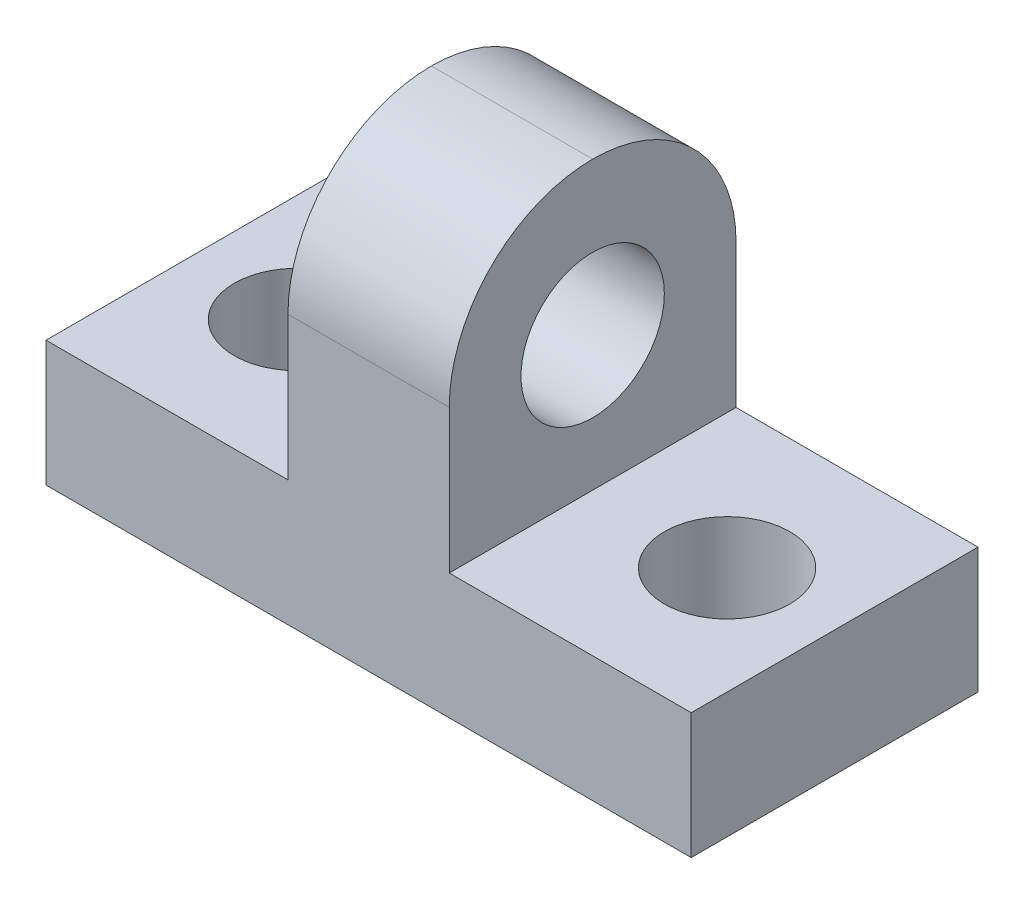
ISO-10303-21;
HEADER;
FILE_DESCRIPTION(('STEP AP214'),'2;1');
FILE_NAME('part.step','',(''),(''),'','','');
FILE_SCHEMA(('AUTOMOTIVE_DESIGN { 1 0 10303 214 1 1 1 1 }'));
ENDSEC;
DATA;
#1=APPLICATION_CONTEXT('core data for automotive mechanical design processes');
#2=APPLICATION_PROTOCOL_DEFINITION('international standard','automotive_design',2000,#1);
#3=PRODUCT_CONTEXT('',#1,'mechanical');
#4=PRODUCT('Part','Part','',(#3));
#5=PRODUCT_RELATED_PRODUCT_CATEGORY('part','',(#4));
#6=PRODUCT_DEFINITION_FORMATION('','',#4);
#7=PRODUCT_DEFINITION_CONTEXT('part definition',#1,'design');
#8=PRODUCT_DEFINITION('design','',#6,#7);
#9=PRODUCT_DEFINITION_SHAPE('','',#8);
#10=(LENGTH_UNIT() NAMED_UNIT(*) SI_UNIT(.MILLI.,.METRE.));
#11=(NAMED_UNIT(*) PLANE_ANGLE_UNIT() SI_UNIT($,.RADIAN.));
#12=(NAMED_UNIT(*) SI_UNIT($,.STERADIAN.) SOLID_ANGLE_UNIT());
#13=UNCERTAINTY_MEASURE_WITH_UNIT(LENGTH_MEASURE(1.E-05),#10,'distance_accuracy_value','');
#14=(GEOMETRIC_REPRESENTATION_CONTEXT(3) GLOBAL_UNCERTAINTY_ASSIGNED_CONTEXT((#13)) GLOBAL_UNIT_ASSIGNED_CONTEXT((#10,
#11,#12)) REPRESENTATION_CONTEXT('',''));
#15=CARTESIAN_POINT('',(0.,0.,0.));
#16=DIRECTION('',(0.,0.,1.));
#17=DIRECTION('',(1.,0.,0.));
#18=AXIS2_PLACEMENT_3D('',#15,#16,#17);
#19=CARTESIAN_POINT('',(-36.,0.,16.));
#20=DIRECTION('',(1.,0.,0.));
#21=DIRECTION('',(0.,1.,0.));
#22=AXIS2_PLACEMENT_3D('',#19,#20,#21);
#23=PLANE('',#22);
#24=DIRECTION('',(0.,-1.,0.));
#25=VECTOR('',#24,1.);
#26=CARTESIAN_POINT('',(-36.,0.,-16.));
#27=LINE('',#26,#25);
#28=CARTESIAN_POINT('',(-36.,14.,-16.));
#29=VERTEX_POINT('',#28);
#30=CARTESIAN_POINT('',(-36.,0.,-16.));
#31=VERTEX_POINT('',#30);
#32=EDGE_CURVE('E131',#29,#31,#27,.T.);
#33=ORIENTED_EDGE('',*,*,#32,.T.);
#34=DIRECTION('',(0.,0.,-1.));
#35=VECTOR('',#34,1.);
#36=CARTESIAN_POINT('',(-36.,0.,16.));
#37=LINE('',#36,#35);
#38=CARTESIAN_POINT('',(-36.,0.,16.));
#39=VERTEX_POINT('',#38);
#40=EDGE_CURVE('E110',#39,#31,#37,.T.);
#41=ORIENTED_EDGE('',*,*,#40,.F.);
#42=DIRECTION('',(0.,-1.,0.));
#43=VECTOR('',#42,1.);
#44=CARTESIAN_POINT('',(-36.,0.,16.));
#45=LINE('',#44,#43);
#46=CARTESIAN_POINT('',(-36.,14.,16.));
#47=VERTEX_POINT('',#46);
#48=EDGE_CURVE('E118',#47,#39,#45,.T.);
#49=ORIENTED_EDGE('',*,*,#48,.F.);
#50=DIRECTION('',(0.,0.,-1.));
#51=VECTOR('',#50,1.);
#52=CARTESIAN_POINT('',(-36.,14.,16.));
#53=LINE('',#52,#51);
#54=EDGE_CURVE('E187',#47,#29,#53,.T.);
#55=ORIENTED_EDGE('',*,*,#54,.T.);
#56=EDGE_LOOP('',(#33,#41,#49,#55));
#57=FACE_BOUND('',#56,.T.);
#58=ADVANCED_FACE('F36',(#57),#23,.F.);
#59=CARTESIAN_POINT('',(36.,0.,16.));
#60=DIRECTION('',(0.,1.,0.));
#61=DIRECTION('',(0.,0.,1.));
#62=AXIS2_PLACEMENT_3D('',#59,#60,#61);
#63=PLANE('',#62);
#64=CARTESIAN_POINT('',(-24.,0.,0.));
#65=DIRECTION('',(0.,1.,0.));
#66=DIRECTION('',(-1.,0.,0.));
#67=AXIS2_PLACEMENT_3D('',#64,#65,#66);
#68=CIRCLE('',#67,7.);
#69=CARTESIAN_POINT('',(-31.,0.,0.));
#70=VERTEX_POINT('',#69);
#71=EDGE_CURVE('E238',#70,#70,#68,.T.);
#72=ORIENTED_EDGE('',*,*,#71,.T.);
#73=EDGE_LOOP('',(#72));
#74=FACE_BOUND('',#73,.T.);
#75=CARTESIAN_POINT('',(24.,0.,0.));
#76=DIRECTION('',(0.,1.,0.));
#77=DIRECTION('',(1.,0.,0.));
#78=AXIS2_PLACEMENT_3D('',#75,#76,#77);
#79=CIRCLE('',#78,7.);
#80=CARTESIAN_POINT('',(31.,0.,0.));
#81=VERTEX_POINT('',#80);
#82=EDGE_CURVE('E229',#81,#81,#79,.T.);
#83=ORIENTED_EDGE('',*,*,#82,.T.);
#84=EDGE_LOOP('',(#83));
#85=FACE_BOUND('',#84,.T.);
#86=DIRECTION('',(1.,0.,0.));
#87=VECTOR('',#86,1.);
#88=CARTESIAN_POINT('',(36.,0.,-16.));
#89=LINE('',#88,#87);
#90=CARTESIAN_POINT('',(36.,0.,-16.));
#91=VERTEX_POINT('',#90);
#92=EDGE_CURVE('E205',#31,#91,#89,.T.);
#93=ORIENTED_EDGE('',*,*,#92,.T.);
#94=DIRECTION('',(0.,0.,-1.));
#95=VECTOR('',#94,1.);
#96=CARTESIAN_POINT('',(36.,0.,16.));
#97=LINE('',#96,#95);
#98=CARTESIAN_POINT('',(36.,0.,16.));
#99=VERTEX_POINT('',#98);
#100=EDGE_CURVE('E113',#99,#91,#97,.T.);
#101=ORIENTED_EDGE('',*,*,#100,.F.);
#102=DIRECTION('',(1.,0.,0.));
#103=VECTOR('',#102,1.);
#104=CARTESIAN_POINT('',(36.,0.,16.));
#105=LINE('',#104,#103);
#106=EDGE_CURVE('E106',#39,#99,#105,.T.);
#107=ORIENTED_EDGE('',*,*,#106,.F.);
#108=ORIENTED_EDGE('',*,*,#40,.T.);
#109=EDGE_LOOP('',(#93,#101,#107,#108));
#110=FACE_BOUND('',#109,.T.);
#111=ADVANCED_FACE('F108',(#74,#85,#110),#63,.F.);
#112=CARTESIAN_POINT('',(36.,0.,16.));
#113=DIRECTION('',(-1.,0.,0.));
#114=DIRECTION('',(0.,-1.,0.));
#115=AXIS2_PLACEMENT_3D('',#112,#113,#114);
#116=PLANE('',#115);
#117=DIRECTION('',(0.,1.,0.));
#118=VECTOR('',#117,1.);
#119=CARTESIAN_POINT('',(36.,0.,-16.));
#120=LINE('',#119,#118);
#121=CARTESIAN_POINT('',(36.,14.,-16.));
#122=VERTEX_POINT('',#121);
#123=EDGE_CURVE('E181',#91,#122,#120,.T.);
#124=ORIENTED_EDGE('',*,*,#123,.T.);
#125=DIRECTION('',(0.,0.,-1.));
#126=VECTOR('',#125,1.);
#127=CARTESIAN_POINT('',(36.,14.,16.));
#128=LINE('',#127,#126);
#129=CARTESIAN_POINT('',(36.,14.,16.));
#130=VERTEX_POINT('',#129);
#131=EDGE_CURVE('E140',#130,#122,#128,.T.);
#132=ORIENTED_EDGE('',*,*,#131,.F.);
#133=DIRECTION('',(0.,1.,0.));
#134=VECTOR('',#133,1.);
#135=CARTESIAN_POINT('',(36.,0.,16.));
#136=LINE('',#135,#134);
#137=EDGE_CURVE('E117',#99,#130,#136,.T.);
#138=ORIENTED_EDGE('',*,*,#137,.F.);
#139=ORIENTED_EDGE('',*,*,#100,.T.);
#140=EDGE_LOOP('',(#124,#132,#138,#139));
#141=FACE_BOUND('',#140,.T.);
#142=ADVANCED_FACE('F269',(#141),#116,.F.);
#143=CARTESIAN_POINT('',(36.,14.,16.));
#144=DIRECTION('',(0.,-1.,0.));
#145=DIRECTION('',(1.,0.,0.));
#146=AXIS2_PLACEMENT_3D('',#143,#144,#145);
#147=PLANE('',#146);
#148=CARTESIAN_POINT('',(24.,14.,0.));
#149=DIRECTION('',(0.,1.,0.));
#150=DIRECTION('',(1.,0.,0.));
#151=AXIS2_PLACEMENT_3D('',#148,#149,#150);
#152=CIRCLE('',#151,7.);
#153=CARTESIAN_POINT('',(31.,14.,0.));
#154=VERTEX_POINT('',#153);
#155=EDGE_CURVE('E225',#154,#154,#152,.T.);
#156=ORIENTED_EDGE('',*,*,#155,.F.);
#157=EDGE_LOOP('',(#156));
#158=FACE_BOUND('',#157,.T.);
#159=DIRECTION('',(-1.,0.,0.));
#160=VECTOR('',#159,1.);
#161=CARTESIAN_POINT('',(36.,14.,-16.));
#162=LINE('',#161,#160);
#163=CARTESIAN_POINT('',(9.,14.,-16.));
#164=VERTEX_POINT('',#163);
#165=EDGE_CURVE('E175',#122,#164,#162,.T.);
#166=ORIENTED_EDGE('',*,*,#165,.T.);
#167=DIRECTION('',(0.,0.,-1.));
#168=VECTOR('',#167,1.);
#169=CARTESIAN_POINT('',(9.,14.,16.));
#170=LINE('',#169,#168);
#171=CARTESIAN_POINT('',(9.,14.,16.));
#172=VERTEX_POINT('',#171);
#173=EDGE_CURVE('E173',#172,#164,#170,.T.);
#174=ORIENTED_EDGE('',*,*,#173,.F.);
#175=DIRECTION('',(-1.,0.,0.));
#176=VECTOR('',#175,1.);
#177=CARTESIAN_POINT('',(36.,14.,16.));
#178=LINE('',#177,#176);
#179=EDGE_CURVE('E202',#130,#172,#178,.T.);
#180=ORIENTED_EDGE('',*,*,#179,.F.);
#181=ORIENTED_EDGE('',*,*,#131,.T.);
#182=EDGE_LOOP('',(#166,#174,#180,#181));
#183=FACE_BOUND('',#182,.T.);
#184=ADVANCED_FACE('F201',(#158,#183),#147,.F.);
#185=CARTESIAN_POINT('',(9.,14.,16.));
#186=DIRECTION('',(-1.,0.,0.));
#187=DIRECTION('',(0.,0.,1.));
#188=AXIS2_PLACEMENT_3D('',#185,#186,#187);
#189=PLANE('',#188);
#190=CARTESIAN_POINT('',(9.,29.,0.));
#191=DIRECTION('',(1.,0.,0.));
#192=DIRECTION('',(0.,0.,-1.));
#193=AXIS2_PLACEMENT_3D('',#190,#191,#192);
#194=CIRCLE('',#193,8.);
#195=CARTESIAN_POINT('',(9.,29.,-8.));
#196=VERTEX_POINT('',#195);
#197=EDGE_CURVE('E242',#196,#196,#194,.T.);
#198=ORIENTED_EDGE('',*,*,#197,.F.);
#199=EDGE_LOOP('',(#198));
#200=FACE_BOUND('',#199,.T.);
#201=DIRECTION('',(0.,1.,0.));
#202=VECTOR('',#201,1.);
#203=CARTESIAN_POINT('',(9.,14.,-16.));
#204=LINE('',#203,#202);
#205=CARTESIAN_POINT('',(9.,30.,-16.));
#206=VERTEX_POINT('',#205);
#207=EDGE_CURVE('E165',#164,#206,#204,.T.);
#208=ORIENTED_EDGE('',*,*,#207,.T.);
#209=CARTESIAN_POINT('',(9.,30.,0.));
#210=DIRECTION('',(-1.,0.,0.));
#211=DIRECTION('',(0.,0.,1.));
#212=AXIS2_PLACEMENT_3D('',#209,#210,#211);
#213=CIRCLE('',#212,16.);
#214=CARTESIAN_POINT('',(9.,46.,0.));
#215=VERTEX_POINT('',#214);
#216=EDGE_CURVE('E46',#206,#215,#213,.F.);
#217=ORIENTED_EDGE('',*,*,#216,.T.);
#218=CARTESIAN_POINT('',(9.,30.,0.));
#219=DIRECTION('',(-1.,0.,0.));
#220=DIRECTION('',(0.,0.,1.));
#221=AXIS2_PLACEMENT_3D('',#218,#219,#220);
#222=CIRCLE('',#221,16.);
#223=CARTESIAN_POINT('',(9.,30.,16.));
#224=VERTEX_POINT('',#223);
#225=EDGE_CURVE('E53',#215,#224,#222,.F.);
#226=ORIENTED_EDGE('',*,*,#225,.T.);
#227=DIRECTION('',(0.,1.,0.));
#228=VECTOR('',#227,1.);
#229=CARTESIAN_POINT('',(9.,14.,16.));
#230=LINE('',#229,#228);
#231=EDGE_CURVE('E218',#172,#224,#230,.T.);
#232=ORIENTED_EDGE('',*,*,#231,.F.);
#233=ORIENTED_EDGE('',*,*,#173,.T.);
#234=EDGE_LOOP('',(#208,#217,#226,#232,#233));
#235=FACE_BOUND('',#234,.T.);
#236=ADVANCED_FACE('F171',(#200,#235),#189,.F.);
#237=CARTESIAN_POINT('',(-9.00000000000001,14.,16.));
#238=DIRECTION('',(1.,0.,0.));
#239=DIRECTION('',(0.,0.,-1.));
#240=AXIS2_PLACEMENT_3D('',#237,#238,#239);
#241=PLANE('',#240);
#242=CARTESIAN_POINT('',(-9.,29.,0.));
#243=DIRECTION('',(1.,0.,0.));
#244=DIRECTION('',(0.,0.,-1.));
#245=AXIS2_PLACEMENT_3D('',#242,#243,#244);
#246=CIRCLE('',#245,8.);
#247=CARTESIAN_POINT('',(-9.,29.,-8.));
#248=VERTEX_POINT('',#247);
#249=EDGE_CURVE('E230',#248,#248,#246,.T.);
#250=ORIENTED_EDGE('',*,*,#249,.T.);
#251=EDGE_LOOP('',(#250));
#252=FACE_BOUND('',#251,.T.);
#253=CARTESIAN_POINT('',(-9.00000000000001,30.,0.));
#254=DIRECTION('',(1.,0.,0.));
#255=DIRECTION('',(0.,0.,-1.));
#256=AXIS2_PLACEMENT_3D('',#253,#254,#255);
#257=CIRCLE('',#256,16.);
#258=CARTESIAN_POINT('',(-9.00000000000001,30.,16.));
#259=VERTEX_POINT('',#258);
#260=CARTESIAN_POINT('',(-9.00000000000001,46.,0.));
#261=VERTEX_POINT('',#260);
#262=EDGE_CURVE('E133',#259,#261,#257,.F.);
#263=ORIENTED_EDGE('',*,*,#262,.T.);
#264=CARTESIAN_POINT('',(-9.00000000000001,30.,0.));
#265=DIRECTION('',(1.,0.,0.));
#266=DIRECTION('',(0.,0.,-1.));
#267=AXIS2_PLACEMENT_3D('',#264,#265,#266);
#268=CIRCLE('',#267,16.);
#269=CARTESIAN_POINT('',(-9.00000000000001,30.,-16.));
#270=VERTEX_POINT('',#269);
#271=EDGE_CURVE('E138',#261,#270,#268,.F.);
#272=ORIENTED_EDGE('',*,*,#271,.T.);
#273=DIRECTION('',(0.,-1.,0.));
#274=VECTOR('',#273,1.);
#275=CARTESIAN_POINT('',(-9.00000000000001,14.,-16.));
#276=LINE('',#275,#274);
#277=CARTESIAN_POINT('',(-9.00000000000001,14.,-16.));
#278=VERTEX_POINT('',#277);
#279=EDGE_CURVE('E167',#270,#278,#276,.T.);
#280=ORIENTED_EDGE('',*,*,#279,.T.);
#281=DIRECTION('',(0.,0.,-1.));
#282=VECTOR('',#281,1.);
#283=CARTESIAN_POINT('',(-9.00000000000001,14.,16.));
#284=LINE('',#283,#282);
#285=CARTESIAN_POINT('',(-9.00000000000001,14.,16.));
#286=VERTEX_POINT('',#285);
#287=EDGE_CURVE('E190',#286,#278,#284,.T.);
#288=ORIENTED_EDGE('',*,*,#287,.F.);
#289=DIRECTION('',(0.,-1.,0.));
#290=VECTOR('',#289,1.);
#291=CARTESIAN_POINT('',(-9.00000000000001,14.,16.));
#292=LINE('',#291,#290);
#293=EDGE_CURVE('E215',#259,#286,#292,.T.);
#294=ORIENTED_EDGE('',*,*,#293,.F.);
#295=EDGE_LOOP('',(#263,#272,#280,#288,#294));
#296=FACE_BOUND('',#295,.T.);
#297=ADVANCED_FACE('F251',(#252,#296),#241,.F.);
#298=CARTESIAN_POINT('',(-36.,14.,16.));
#299=DIRECTION('',(0.,-1.,0.));
#300=DIRECTION('',(1.,0.,0.));
#301=AXIS2_PLACEMENT_3D('',#298,#299,#300);
#302=PLANE('',#301);
#303=CARTESIAN_POINT('',(-24.,14.,0.));
#304=DIRECTION('',(0.,1.,0.));
#305=DIRECTION('',(-1.,0.,0.));
#306=AXIS2_PLACEMENT_3D('',#303,#304,#305);
#307=CIRCLE('',#306,7.);
#308=CARTESIAN_POINT('',(-31.,14.,0.));
#309=VERTEX_POINT('',#308);
#310=EDGE_CURVE('E234',#309,#309,#307,.T.);
#311=ORIENTED_EDGE('',*,*,#310,.F.);
#312=EDGE_LOOP('',(#311));
#313=FACE_BOUND('',#312,.T.);
#314=DIRECTION('',(-1.,0.,0.));
#315=VECTOR('',#314,1.);
#316=CARTESIAN_POINT('',(-36.,14.,-16.));
#317=LINE('',#316,#315);
#318=EDGE_CURVE('E128',#278,#29,#317,.T.);
#319=ORIENTED_EDGE('',*,*,#318,.T.);
#320=ORIENTED_EDGE('',*,*,#54,.F.);
#321=DIRECTION('',(-1.,0.,0.));
#322=VECTOR('',#321,1.);
#323=CARTESIAN_POINT('',(-36.,14.,16.));
#324=LINE('',#323,#322);
#325=EDGE_CURVE('E123',#286,#47,#324,.T.);
#326=ORIENTED_EDGE('',*,*,#325,.F.);
#327=ORIENTED_EDGE('',*,*,#287,.T.);
#328=EDGE_LOOP('',(#319,#320,#326,#327));
#329=FACE_BOUND('',#328,.T.);
#330=ADVANCED_FACE('F267',(#313,#329),#302,.F.);
#331=CARTESIAN_POINT('',(0.,0.,16.));
#332=DIRECTION('',(0.,0.,-1.));
#333=DIRECTION('',(-1.,0.,0.));
#334=AXIS2_PLACEMENT_3D('',#331,#332,#333);
#335=PLANE('',#334);
#336=ORIENTED_EDGE('',*,*,#231,.T.);
#337=DIRECTION('',(-1.,0.,0.));
#338=VECTOR('',#337,1.);
#339=CARTESIAN_POINT('',(0.,30.,16.));
#340=LINE('',#339,#338);
#341=EDGE_CURVE('E11',#224,#259,#340,.T.);
#342=ORIENTED_EDGE('',*,*,#341,.T.);
#343=ORIENTED_EDGE('',*,*,#293,.T.);
#344=ORIENTED_EDGE('',*,*,#325,.T.);
#345=ORIENTED_EDGE('',*,*,#48,.T.);
#346=ORIENTED_EDGE('',*,*,#106,.T.);
#347=ORIENTED_EDGE('',*,*,#137,.T.);
#348=ORIENTED_EDGE('',*,*,#179,.T.);
#349=EDGE_LOOP('',(#336,#342,#343,#344,#345,#346,#347,#348));
#350=FACE_BOUND('',#349,.T.);
#351=ADVANCED_FACE('F121',(#350),#335,.F.);
#352=CARTESIAN_POINT('',(0.,0.,-16.));
#353=DIRECTION('',(0.,0.,-1.));
#354=DIRECTION('',(-1.,0.,0.));
#355=AXIS2_PLACEMENT_3D('',#352,#353,#354);
#356=PLANE('',#355);
#357=ORIENTED_EDGE('',*,*,#279,.F.);
#358=DIRECTION('',(-1.,0.,0.));
#359=VECTOR('',#358,1.);
#360=CARTESIAN_POINT('',(9.,30.,-16.));
#361=LINE('',#360,#359);
#362=EDGE_CURVE('E146',#270,#206,#361,.F.);
#363=ORIENTED_EDGE('',*,*,#362,.T.);
#364=ORIENTED_EDGE('',*,*,#207,.F.);
#365=ORIENTED_EDGE('',*,*,#165,.F.);
#366=ORIENTED_EDGE('',*,*,#123,.F.);
#367=ORIENTED_EDGE('',*,*,#92,.F.);
#368=ORIENTED_EDGE('',*,*,#32,.F.);
#369=ORIENTED_EDGE('',*,*,#318,.F.);
#370=EDGE_LOOP('',(#357,#363,#364,#365,#366,#367,#368,#369));
#371=FACE_BOUND('',#370,.T.);
#372=ADVANCED_FACE('F163',(#371),#356,.T.);
#373=CARTESIAN_POINT('',(0.,30.,0.));
#374=DIRECTION('',(-1.,0.,0.));
#375=DIRECTION('',(0.,0.,1.));
#376=AXIS2_PLACEMENT_3D('',#373,#374,#375);
#377=CYLINDRICAL_SURFACE('',#376,16.);
#378=ORIENTED_EDGE('',*,*,#341,.F.);
#379=ORIENTED_EDGE('',*,*,#225,.F.);
#380=DIRECTION('',(-1.,0.,0.));
#381=VECTOR('',#380,1.);
#382=CARTESIAN_POINT('',(-9.00000000000001,46.,0.));
#383=LINE('',#382,#381);
#384=EDGE_CURVE('E40',#261,#215,#383,.F.);
#385=ORIENTED_EDGE('',*,*,#384,.F.);
#386=ORIENTED_EDGE('',*,*,#262,.F.);
#387=EDGE_LOOP('',(#378,#379,#385,#386));
#388=FACE_BOUND('',#387,.T.);
#389=ADVANCED_FACE('F38',(#388),#377,.T.);
#390=CARTESIAN_POINT('',(-9.00000000000001,30.,0.));
#391=DIRECTION('',(1.,0.,0.));
#392=DIRECTION('',(0.,0.,-1.));
#393=AXIS2_PLACEMENT_3D('',#390,#391,#392);
#394=CYLINDRICAL_SURFACE('',#393,16.);
#395=ORIENTED_EDGE('',*,*,#216,.F.);
#396=ORIENTED_EDGE('',*,*,#362,.F.);
#397=ORIENTED_EDGE('',*,*,#271,.F.);
#398=ORIENTED_EDGE('',*,*,#384,.T.);
#399=EDGE_LOOP('',(#395,#396,#397,#398));
#400=FACE_BOUND('',#399,.T.);
#401=ADVANCED_FACE('F280',(#400),#394,.T.);
#402=CARTESIAN_POINT('',(-24.,0.,0.));
#403=DIRECTION('',(0.,1.,0.));
#404=DIRECTION('',(-1.,0.,0.));
#405=AXIS2_PLACEMENT_3D('',#402,#403,#404);
#406=CYLINDRICAL_SURFACE('',#405,7.);
#407=ORIENTED_EDGE('',*,*,#71,.F.);
#408=EDGE_LOOP('',(#407));
#409=FACE_BOUND('',#408,.T.);
#410=ORIENTED_EDGE('',*,*,#310,.T.);
#411=EDGE_LOOP('',(#410));
#412=FACE_BOUND('',#411,.T.);
#413=ADVANCED_FACE('F282',(#409,#412),#406,.F.);
#414=CARTESIAN_POINT('',(24.,0.,0.));
#415=DIRECTION('',(0.,1.,0.));
#416=DIRECTION('',(-1.,0.,0.));
#417=AXIS2_PLACEMENT_3D('',#414,#415,#416);
#418=CYLINDRICAL_SURFACE('',#417,7.);
#419=ORIENTED_EDGE('',*,*,#82,.F.);
#420=EDGE_LOOP('',(#419));
#421=FACE_BOUND('',#420,.T.);
#422=ORIENTED_EDGE('',*,*,#155,.T.);
#423=EDGE_LOOP('',(#422));
#424=FACE_BOUND('',#423,.T.);
#425=ADVANCED_FACE('F257',(#421,#424),#418,.F.);
#426=CARTESIAN_POINT('',(-9.,29.,0.));
#427=DIRECTION('',(1.,0.,0.));
#428=DIRECTION('',(0.,0.,-1.));
#429=AXIS2_PLACEMENT_3D('',#426,#427,#428);
#430=CYLINDRICAL_SURFACE('',#429,8.);
#431=ORIENTED_EDGE('',*,*,#249,.F.);
#432=EDGE_LOOP('',(#431));
#433=FACE_BOUND('',#432,.T.);
#434=ORIENTED_EDGE('',*,*,#197,.T.);
#435=EDGE_LOOP('',(#434));
#436=FACE_BOUND('',#435,.T.);
#437=ADVANCED_FACE('F254',(#433,#436),#430,.F.);
#438=CLOSED_SHELL('',(#58,#111,#142,#184,#236,#297,#330,#351,#372,#389,#401,#413,#425,#437));
#439=MANIFOLD_SOLID_BREP('B2',#438);
#440=ADVANCED_BREP_SHAPE_REPRESENTATION('',(#18,#439),#14);
#441=SHAPE_DEFINITION_REPRESENTATION(#9,#440);
ENDSEC;
END-ISO-10303-21;
